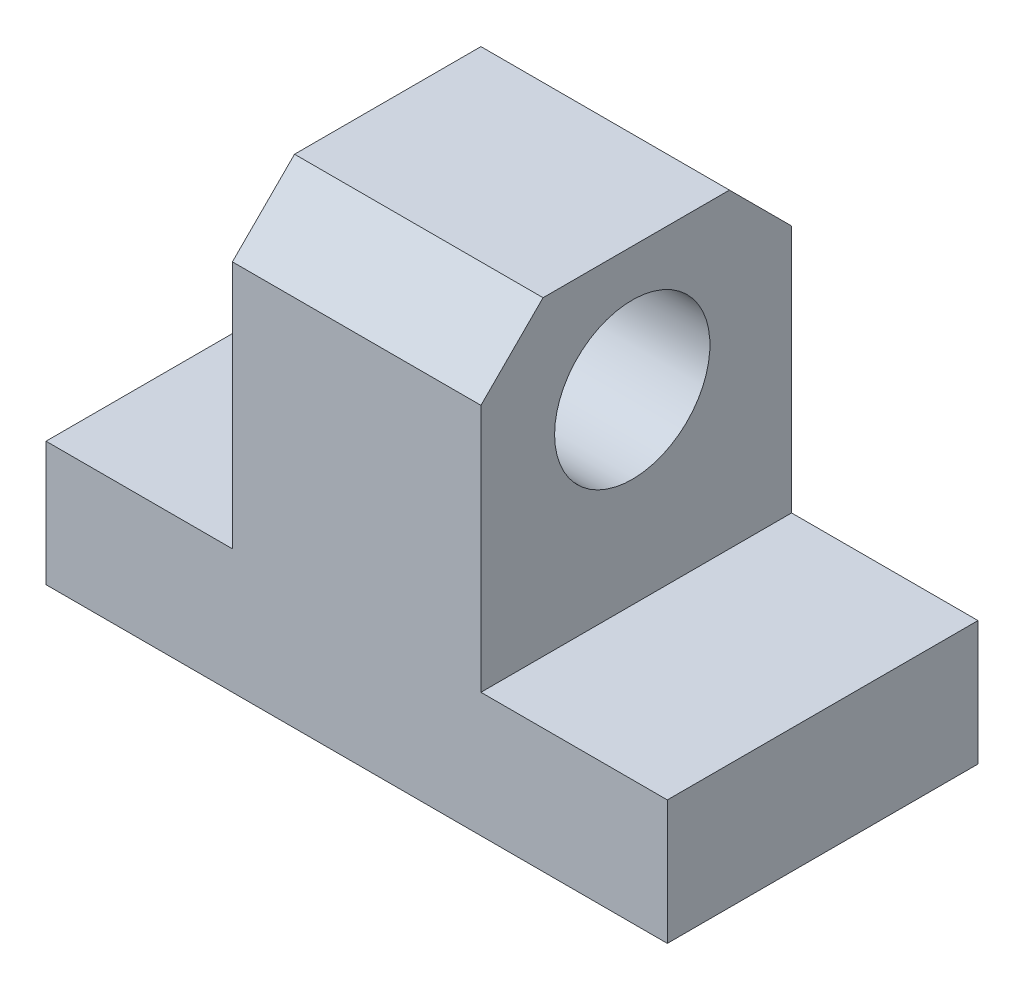
ISO-10303-21;
HEADER;
FILE_DESCRIPTION(('STEP AP214'),'2;1');
FILE_NAME('part.step','',(''),(''),'','','');
FILE_SCHEMA(('AUTOMOTIVE_DESIGN { 1 0 10303 214 1 1 1 1 }'));
ENDSEC;
DATA;
#1=APPLICATION_CONTEXT('core data for automotive mechanical design processes');
#2=APPLICATION_PROTOCOL_DEFINITION('international standard','automotive_design',2000,#1);
#3=PRODUCT_CONTEXT('',#1,'mechanical');
#4=PRODUCT('Part','Part','',(#3));
#5=PRODUCT_RELATED_PRODUCT_CATEGORY('part','',(#4));
#6=PRODUCT_DEFINITION_FORMATION('','',#4);
#7=PRODUCT_DEFINITION_CONTEXT('part definition',#1,'design');
#8=PRODUCT_DEFINITION('design','',#6,#7);
#9=PRODUCT_DEFINITION_SHAPE('','',#8);
#10=(LENGTH_UNIT() NAMED_UNIT(*) SI_UNIT(.MILLI.,.METRE.));
#11=(NAMED_UNIT(*) PLANE_ANGLE_UNIT() SI_UNIT($,.RADIAN.));
#12=(NAMED_UNIT(*) SI_UNIT($,.STERADIAN.) SOLID_ANGLE_UNIT());
#13=UNCERTAINTY_MEASURE_WITH_UNIT(LENGTH_MEASURE(1.E-05),#10,'distance_accuracy_value','');
#14=(GEOMETRIC_REPRESENTATION_CONTEXT(3) GLOBAL_UNCERTAINTY_ASSIGNED_CONTEXT((#13)) GLOBAL_UNIT_ASSIGNED_CONTEXT((#10,
#11,#12)) REPRESENTATION_CONTEXT('',''));
#15=CARTESIAN_POINT('',(0.,0.,0.));
#16=DIRECTION('',(0.,0.,1.));
#17=DIRECTION('',(1.,0.,0.));
#18=AXIS2_PLACEMENT_3D('',#15,#16,#17);
#19=CARTESIAN_POINT('',(9.99999999999999,4.,4.99999999999999));
#20=DIRECTION('',(0.,1.,0.));
#21=DIRECTION('',(0.,0.,1.));
#22=AXIS2_PLACEMENT_3D('',#19,#20,#21);
#23=PLANE('',#22);
#24=DIRECTION('',(0.,0.,-1.));
#25=VECTOR('',#24,1.);
#26=CARTESIAN_POINT('',(4.,4.,-4.99999999999999));
#27=LINE('',#26,#25);
#28=CARTESIAN_POINT('',(4.,4.,4.99999999999999));
#29=VERTEX_POINT('',#28);
#30=CARTESIAN_POINT('',(4.,4.,-5.00000000000001));
#31=VERTEX_POINT('',#30);
#32=EDGE_CURVE('E134',#29,#31,#27,.T.);
#33=ORIENTED_EDGE('',*,*,#32,.F.);
#34=DIRECTION('',(1.,0.,0.));
#35=VECTOR('',#34,1.);
#36=CARTESIAN_POINT('',(-10.,4.,4.99999999999999));
#37=LINE('',#36,#35);
#38=CARTESIAN_POINT('',(9.99999999999999,4.,4.99999999999999));
#39=VERTEX_POINT('',#38);
#40=EDGE_CURVE('E129',#29,#39,#37,.T.);
#41=ORIENTED_EDGE('',*,*,#40,.T.);
#42=DIRECTION('',(0.,0.,-1.));
#43=VECTOR('',#42,1.);
#44=CARTESIAN_POINT('',(9.99999999999998,4.,-5.00000000000001));
#45=LINE('',#44,#43);
#46=CARTESIAN_POINT('',(9.99999999999998,4.,-5.00000000000001));
#47=VERTEX_POINT('',#46);
#48=EDGE_CURVE('E153',#39,#47,#45,.T.);
#49=ORIENTED_EDGE('',*,*,#48,.T.);
#50=DIRECTION('',(-1.,0.,0.));
#51=VECTOR('',#50,1.);
#52=CARTESIAN_POINT('',(-10.,4.,-5.00000000000001));
#53=LINE('',#52,#51);
#54=EDGE_CURVE('E163',#47,#31,#53,.T.);
#55=ORIENTED_EDGE('',*,*,#54,.T.);
#56=EDGE_LOOP('',(#33,#41,#49,#55));
#57=FACE_BOUND('',#56,.T.);
#58=ADVANCED_FACE('F31',(#57),#23,.T.);
#59=CARTESIAN_POINT('',(9.99999999999998,4.,-5.00000000000001));
#60=DIRECTION('',(-1.,0.,0.));
#61=DIRECTION('',(0.,0.,1.));
#62=AXIS2_PLACEMENT_3D('',#59,#60,#61);
#63=PLANE('',#62);
#64=DIRECTION('',(0.,0.,-1.));
#65=VECTOR('',#64,1.);
#66=CARTESIAN_POINT('',(9.99999999999998,0.,-5.00000000000001));
#67=LINE('',#66,#65);
#68=CARTESIAN_POINT('',(9.99999999999999,0.,4.99999999999999));
#69=VERTEX_POINT('',#68);
#70=CARTESIAN_POINT('',(9.99999999999998,0.,-5.00000000000001));
#71=VERTEX_POINT('',#70);
#72=EDGE_CURVE('E182',#69,#71,#67,.T.);
#73=ORIENTED_EDGE('',*,*,#72,.T.);
#74=DIRECTION('',(0.,-1.,0.));
#75=VECTOR('',#74,1.);
#76=CARTESIAN_POINT('',(9.99999999999998,4.,-5.00000000000001));
#77=LINE('',#76,#75);
#78=EDGE_CURVE('E166',#47,#71,#77,.T.);
#79=ORIENTED_EDGE('',*,*,#78,.F.);
#80=ORIENTED_EDGE('',*,*,#48,.F.);
#81=DIRECTION('',(0.,-1.,0.));
#82=VECTOR('',#81,1.);
#83=CARTESIAN_POINT('',(9.99999999999999,4.,4.99999999999999));
#84=LINE('',#83,#82);
#85=EDGE_CURVE('E128',#39,#69,#84,.T.);
#86=ORIENTED_EDGE('',*,*,#85,.T.);
#87=EDGE_LOOP('',(#73,#79,#80,#86));
#88=FACE_BOUND('',#87,.T.);
#89=ADVANCED_FACE('F229',(#88),#63,.F.);
#90=CARTESIAN_POINT('',(-10.,4.,-5.00000000000001));
#91=DIRECTION('',(0.,0.,1.));
#92=DIRECTION('',(1.,0.,0.));
#93=AXIS2_PLACEMENT_3D('',#90,#91,#92);
#94=PLANE('',#93);
#95=DIRECTION('',(0.,-1.,0.));
#96=VECTOR('',#95,1.);
#97=CARTESIAN_POINT('',(-4.,14.,-4.99999999999999));
#98=LINE('',#97,#96);
#99=CARTESIAN_POINT('',(-4.,12.,-4.99999999999999));
#100=VERTEX_POINT('',#99);
#101=CARTESIAN_POINT('',(-4.,4.,-5.00000000000001));
#102=VERTEX_POINT('',#101);
#103=EDGE_CURVE('E117',#100,#102,#98,.T.);
#104=ORIENTED_EDGE('',*,*,#103,.F.);
#105=DIRECTION('',(1.,0.,0.));
#106=VECTOR('',#105,1.);
#107=CARTESIAN_POINT('',(4.,12.,-5.00000000000001));
#108=LINE('',#107,#106);
#109=CARTESIAN_POINT('',(4.,12.,-4.99999999999999));
#110=VERTEX_POINT('',#109);
#111=EDGE_CURVE('E54',#100,#110,#108,.T.);
#112=ORIENTED_EDGE('',*,*,#111,.T.);
#113=DIRECTION('',(0.,-1.,0.));
#114=VECTOR('',#113,1.);
#115=CARTESIAN_POINT('',(4.,14.,-4.99999999999999));
#116=LINE('',#115,#114);
#117=EDGE_CURVE('E184',#110,#31,#116,.T.);
#118=ORIENTED_EDGE('',*,*,#117,.T.);
#119=ORIENTED_EDGE('',*,*,#54,.F.);
#120=ORIENTED_EDGE('',*,*,#78,.T.);
#121=DIRECTION('',(-1.,0.,0.));
#122=VECTOR('',#121,1.);
#123=CARTESIAN_POINT('',(-10.,0.,-5.00000000000001));
#124=LINE('',#123,#122);
#125=CARTESIAN_POINT('',(-10.,0.,-5.00000000000001));
#126=VERTEX_POINT('',#125);
#127=EDGE_CURVE('E180',#71,#126,#124,.T.);
#128=ORIENTED_EDGE('',*,*,#127,.T.);
#129=DIRECTION('',(0.,-1.,0.));
#130=VECTOR('',#129,1.);
#131=CARTESIAN_POINT('',(-10.,4.,-5.00000000000001));
#132=LINE('',#131,#130);
#133=CARTESIAN_POINT('',(-10.,4.,-5.00000000000001));
#134=VERTEX_POINT('',#133);
#135=EDGE_CURVE('E170',#134,#126,#132,.T.);
#136=ORIENTED_EDGE('',*,*,#135,.F.);
#137=EDGE_CURVE('E156',#102,#134,#53,.T.);
#138=ORIENTED_EDGE('',*,*,#137,.F.);
#139=EDGE_LOOP('',(#104,#112,#118,#119,#120,#128,#136,#138));
#140=FACE_BOUND('',#139,.T.);
#141=ADVANCED_FACE('F218',(#140),#94,.F.);
#142=CARTESIAN_POINT('',(-10.,4.,-5.00000000000001));
#143=DIRECTION('',(1.,0.,0.));
#144=DIRECTION('',(0.,0.,-1.));
#145=AXIS2_PLACEMENT_3D('',#142,#143,#144);
#146=PLANE('',#145);
#147=DIRECTION('',(0.,0.,1.));
#148=VECTOR('',#147,1.);
#149=CARTESIAN_POINT('',(-10.,0.,-5.00000000000001));
#150=LINE('',#149,#148);
#151=CARTESIAN_POINT('',(-10.,0.,4.99999999999999));
#152=VERTEX_POINT('',#151);
#153=EDGE_CURVE('E178',#126,#152,#150,.T.);
#154=ORIENTED_EDGE('',*,*,#153,.T.);
#155=DIRECTION('',(0.,-1.,0.));
#156=VECTOR('',#155,1.);
#157=CARTESIAN_POINT('',(-10.,4.,4.99999999999999));
#158=LINE('',#157,#156);
#159=CARTESIAN_POINT('',(-10.,4.,4.99999999999999));
#160=VERTEX_POINT('',#159);
#161=EDGE_CURVE('E173',#160,#152,#158,.T.);
#162=ORIENTED_EDGE('',*,*,#161,.F.);
#163=DIRECTION('',(0.,0.,1.));
#164=VECTOR('',#163,1.);
#165=CARTESIAN_POINT('',(-10.,4.,-5.00000000000001));
#166=LINE('',#165,#164);
#167=EDGE_CURVE('E126',#134,#160,#166,.T.);
#168=ORIENTED_EDGE('',*,*,#167,.F.);
#169=ORIENTED_EDGE('',*,*,#135,.T.);
#170=EDGE_LOOP('',(#154,#162,#168,#169));
#171=FACE_BOUND('',#170,.T.);
#172=ADVANCED_FACE('F222',(#171),#146,.F.);
#173=CARTESIAN_POINT('',(-10.,4.,4.99999999999999));
#174=DIRECTION('',(0.,0.,-1.));
#175=DIRECTION('',(-1.,0.,0.));
#176=AXIS2_PLACEMENT_3D('',#173,#174,#175);
#177=PLANE('',#176);
#178=DIRECTION('',(0.,-1.,0.));
#179=VECTOR('',#178,1.);
#180=CARTESIAN_POINT('',(4.,14.,4.99999999999999));
#181=LINE('',#180,#179);
#182=CARTESIAN_POINT('',(4.,12.,4.99999999999999));
#183=VERTEX_POINT('',#182);
#184=EDGE_CURVE('E118',#183,#29,#181,.T.);
#185=ORIENTED_EDGE('',*,*,#184,.F.);
#186=DIRECTION('',(-1.,0.,0.));
#187=VECTOR('',#186,1.);
#188=CARTESIAN_POINT('',(-4.,12.,4.99999999999999));
#189=LINE('',#188,#187);
#190=CARTESIAN_POINT('',(-4.,12.,4.99999999999999));
#191=VERTEX_POINT('',#190);
#192=EDGE_CURVE('E11',#183,#191,#189,.T.);
#193=ORIENTED_EDGE('',*,*,#192,.T.);
#194=DIRECTION('',(0.,-1.,0.));
#195=VECTOR('',#194,1.);
#196=CARTESIAN_POINT('',(-4.,14.,4.99999999999999));
#197=LINE('',#196,#195);
#198=CARTESIAN_POINT('',(-4.,4.,4.99999999999999));
#199=VERTEX_POINT('',#198);
#200=EDGE_CURVE('E108',#191,#199,#197,.T.);
#201=ORIENTED_EDGE('',*,*,#200,.T.);
#202=EDGE_CURVE('E112',#160,#199,#37,.T.);
#203=ORIENTED_EDGE('',*,*,#202,.F.);
#204=ORIENTED_EDGE('',*,*,#161,.T.);
#205=DIRECTION('',(1.,0.,0.));
#206=VECTOR('',#205,1.);
#207=CARTESIAN_POINT('',(-10.,0.,4.99999999999999));
#208=LINE('',#207,#206);
#209=EDGE_CURVE('E157',#152,#69,#208,.T.);
#210=ORIENTED_EDGE('',*,*,#209,.T.);
#211=ORIENTED_EDGE('',*,*,#85,.F.);
#212=ORIENTED_EDGE('',*,*,#40,.F.);
#213=EDGE_LOOP('',(#185,#193,#201,#203,#204,#210,#211,#212));
#214=FACE_BOUND('',#213,.T.);
#215=ADVANCED_FACE('F110',(#214),#177,.F.);
#216=DIRECTION('',(0.,0.,1.));
#217=VECTOR('',#216,1.);
#218=CARTESIAN_POINT('',(-4.,4.,-4.99999999999999));
#219=LINE('',#218,#217);
#220=EDGE_CURVE('E123',#102,#199,#219,.T.);
#221=ORIENTED_EDGE('',*,*,#220,.F.);
#222=ORIENTED_EDGE('',*,*,#137,.T.);
#223=ORIENTED_EDGE('',*,*,#167,.T.);
#224=ORIENTED_EDGE('',*,*,#202,.T.);
#225=EDGE_LOOP('',(#221,#222,#223,#224));
#226=FACE_BOUND('',#225,.T.);
#227=ADVANCED_FACE('F122',(#226),#23,.T.);
#228=CARTESIAN_POINT('',(9.99999999999999,0.,4.99999999999999));
#229=DIRECTION('',(0.,1.,0.));
#230=DIRECTION('',(0.,0.,1.));
#231=AXIS2_PLACEMENT_3D('',#228,#229,#230);
#232=PLANE('',#231);
#233=ORIENTED_EDGE('',*,*,#72,.F.);
#234=ORIENTED_EDGE('',*,*,#209,.F.);
#235=ORIENTED_EDGE('',*,*,#153,.F.);
#236=ORIENTED_EDGE('',*,*,#127,.F.);
#237=EDGE_LOOP('',(#233,#234,#235,#236));
#238=FACE_BOUND('',#237,.T.);
#239=ADVANCED_FACE('F245',(#238),#232,.F.);
#240=CARTESIAN_POINT('',(4.,14.,-4.99999999999999));
#241=DIRECTION('',(-1.,0.,0.));
#242=DIRECTION('',(0.,0.,1.));
#243=AXIS2_PLACEMENT_3D('',#240,#241,#242);
#244=PLANE('',#243);
#245=CARTESIAN_POINT('',(4.,9.99999999999044,0.128840194244529));
#246=DIRECTION('',(-1.,0.,0.));
#247=DIRECTION('',(0.,0.,1.));
#248=AXIS2_PLACEMENT_3D('',#245,#246,#247);
#249=CIRCLE('',#248,2.49999533926605);
#250=CARTESIAN_POINT('',(4.,9.99999999999044,2.62883553351057));
#251=VERTEX_POINT('',#250);
#252=EDGE_CURVE('E140',#251,#251,#249,.T.);
#253=ORIENTED_EDGE('',*,*,#252,.T.);
#254=EDGE_LOOP('',(#253));
#255=FACE_BOUND('',#254,.T.);
#256=ORIENTED_EDGE('',*,*,#117,.F.);
#257=DIRECTION('',(0.,0.707106781186549,0.707106781186546));
#258=VECTOR('',#257,1.);
#259=CARTESIAN_POINT('',(4.,14.,-3.));
#260=LINE('',#259,#258);
#261=CARTESIAN_POINT('',(4.,14.,-3.));
#262=VERTEX_POINT('',#261);
#263=EDGE_CURVE('E39',#110,#262,#260,.T.);
#264=ORIENTED_EDGE('',*,*,#263,.T.);
#265=DIRECTION('',(0.,0.,-1.));
#266=VECTOR('',#265,1.);
#267=CARTESIAN_POINT('',(4.,14.,-4.99999999999999));
#268=LINE('',#267,#266);
#269=CARTESIAN_POINT('',(4.,14.,2.99999999999999));
#270=VERTEX_POINT('',#269);
#271=EDGE_CURVE('E133',#270,#262,#268,.T.);
#272=ORIENTED_EDGE('',*,*,#271,.F.);
#273=DIRECTION('',(0.,-0.707106781186549,0.707106781186546));
#274=VECTOR('',#273,1.);
#275=CARTESIAN_POINT('',(4.,14.,3.));
#276=LINE('',#275,#274);
#277=EDGE_CURVE('E46',#270,#183,#276,.T.);
#278=ORIENTED_EDGE('',*,*,#277,.T.);
#279=ORIENTED_EDGE('',*,*,#184,.T.);
#280=ORIENTED_EDGE('',*,*,#32,.T.);
#281=EDGE_LOOP('',(#256,#264,#272,#278,#279,#280));
#282=FACE_BOUND('',#281,.T.);
#283=ADVANCED_FACE('F206',(#255,#282),#244,.F.);
#284=CARTESIAN_POINT('',(-4.,14.,-4.99999999999999));
#285=DIRECTION('',(1.,0.,0.));
#286=DIRECTION('',(0.,0.,-1.));
#287=AXIS2_PLACEMENT_3D('',#284,#285,#286);
#288=PLANE('',#287);
#289=CARTESIAN_POINT('',(-4.,9.99999999999044,0.128840194244529));
#290=DIRECTION('',(-1.,0.,0.));
#291=DIRECTION('',(0.,0.,1.));
#292=AXIS2_PLACEMENT_3D('',#289,#290,#291);
#293=CIRCLE('',#292,2.49999533926605);
#294=CARTESIAN_POINT('',(-4.,9.99999999999044,2.62883553351057));
#295=VERTEX_POINT('',#294);
#296=EDGE_CURVE('E346',#295,#295,#293,.T.);
#297=ORIENTED_EDGE('',*,*,#296,.F.);
#298=EDGE_LOOP('',(#297));
#299=FACE_BOUND('',#298,.T.);
#300=DIRECTION('',(0.,0.,1.));
#301=VECTOR('',#300,1.);
#302=CARTESIAN_POINT('',(-4.,14.,-4.99999999999999));
#303=LINE('',#302,#301);
#304=CARTESIAN_POINT('',(-4.,14.,-3.));
#305=VERTEX_POINT('',#304);
#306=CARTESIAN_POINT('',(-4.,14.,2.99999999999999));
#307=VERTEX_POINT('',#306);
#308=EDGE_CURVE('E137',#305,#307,#303,.T.);
#309=ORIENTED_EDGE('',*,*,#308,.F.);
#310=DIRECTION('',(0.,-0.707106781186549,-0.707106781186546));
#311=VECTOR('',#310,1.);
#312=CARTESIAN_POINT('',(-4.,14.,-3.));
#313=LINE('',#312,#311);
#314=EDGE_CURVE('E195',#305,#100,#313,.T.);
#315=ORIENTED_EDGE('',*,*,#314,.T.);
#316=ORIENTED_EDGE('',*,*,#103,.T.);
#317=ORIENTED_EDGE('',*,*,#220,.T.);
#318=ORIENTED_EDGE('',*,*,#200,.F.);
#319=DIRECTION('',(0.,0.707106781186549,-0.707106781186546));
#320=VECTOR('',#319,1.);
#321=CARTESIAN_POINT('',(-4.,14.,3.));
#322=LINE('',#321,#320);
#323=EDGE_CURVE('E217',#191,#307,#322,.T.);
#324=ORIENTED_EDGE('',*,*,#323,.T.);
#325=EDGE_LOOP('',(#309,#315,#316,#317,#318,#324));
#326=FACE_BOUND('',#325,.T.);
#327=ADVANCED_FACE('F132',(#299,#326),#288,.F.);
#328=CARTESIAN_POINT('',(4.,14.,4.99999999999999));
#329=DIRECTION('',(0.,1.,0.));
#330=DIRECTION('',(0.,0.,1.));
#331=AXIS2_PLACEMENT_3D('',#328,#329,#330);
#332=PLANE('',#331);
#333=ORIENTED_EDGE('',*,*,#271,.T.);
#334=DIRECTION('',(-1.,0.,0.));
#335=VECTOR('',#334,1.);
#336=CARTESIAN_POINT('',(-4.,14.,-3.));
#337=LINE('',#336,#335);
#338=EDGE_CURVE('E214',#262,#305,#337,.T.);
#339=ORIENTED_EDGE('',*,*,#338,.T.);
#340=ORIENTED_EDGE('',*,*,#308,.T.);
#341=DIRECTION('',(1.,0.,0.));
#342=VECTOR('',#341,1.);
#343=CARTESIAN_POINT('',(4.,14.,3.));
#344=LINE('',#343,#342);
#345=EDGE_CURVE('E169',#307,#270,#344,.T.);
#346=ORIENTED_EDGE('',*,*,#345,.T.);
#347=EDGE_LOOP('',(#333,#339,#340,#346));
#348=FACE_BOUND('',#347,.T.);
#349=ADVANCED_FACE('F212',(#348),#332,.T.);
#350=CARTESIAN_POINT('',(10.000025,9.99999999999044,0.128840194244529));
#351=DIRECTION('',(-1.,0.,0.));
#352=DIRECTION('',(0.,0.,1.));
#353=AXIS2_PLACEMENT_3D('',#350,#351,#352);
#354=CYLINDRICAL_SURFACE('',#353,2.49999533926605);
#355=ORIENTED_EDGE('',*,*,#296,.T.);
#356=EDGE_LOOP('',(#355));
#357=FACE_BOUND('',#356,.T.);
#358=ORIENTED_EDGE('',*,*,#252,.F.);
#359=EDGE_LOOP('',(#358));
#360=FACE_BOUND('',#359,.T.);
#361=ADVANCED_FACE('F235',(#357,#360),#354,.F.);
#362=CARTESIAN_POINT('',(4.,14.,-3.));
#363=DIRECTION('',(0.,0.707106781186546,-0.707106781186549));
#364=DIRECTION('',(0.,0.707106781186549,0.707106781186546));
#365=AXIS2_PLACEMENT_3D('',#362,#363,#364);
#366=PLANE('',#365);
#367=ORIENTED_EDGE('',*,*,#263,.F.);
#368=ORIENTED_EDGE('',*,*,#111,.F.);
#369=ORIENTED_EDGE('',*,*,#314,.F.);
#370=ORIENTED_EDGE('',*,*,#338,.F.);
#371=EDGE_LOOP('',(#367,#368,#369,#370));
#372=FACE_BOUND('',#371,.T.);
#373=ADVANCED_FACE('F216',(#372),#366,.T.);
#374=CARTESIAN_POINT('',(4.,14.,3.));
#375=DIRECTION('',(0.,0.707106781186546,0.707106781186549));
#376=DIRECTION('',(0.,-0.707106781186549,0.707106781186546));
#377=AXIS2_PLACEMENT_3D('',#374,#375,#376);
#378=PLANE('',#377);
#379=ORIENTED_EDGE('',*,*,#323,.F.);
#380=ORIENTED_EDGE('',*,*,#192,.F.);
#381=ORIENTED_EDGE('',*,*,#277,.F.);
#382=ORIENTED_EDGE('',*,*,#345,.F.);
#383=EDGE_LOOP('',(#379,#380,#381,#382));
#384=FACE_BOUND('',#383,.T.);
#385=ADVANCED_FACE('F33',(#384),#378,.T.);
#386=CLOSED_SHELL('',(#58,#89,#141,#172,#215,#227,#239,#283,#327,#349,#361,#373,#385));
#387=MANIFOLD_SOLID_BREP('B2',#386);
#388=ADVANCED_BREP_SHAPE_REPRESENTATION('',(#18,#387),#14);
#389=SHAPE_DEFINITION_REPRESENTATION(#9,#388);
ENDSEC;
END-ISO-10303-21;
